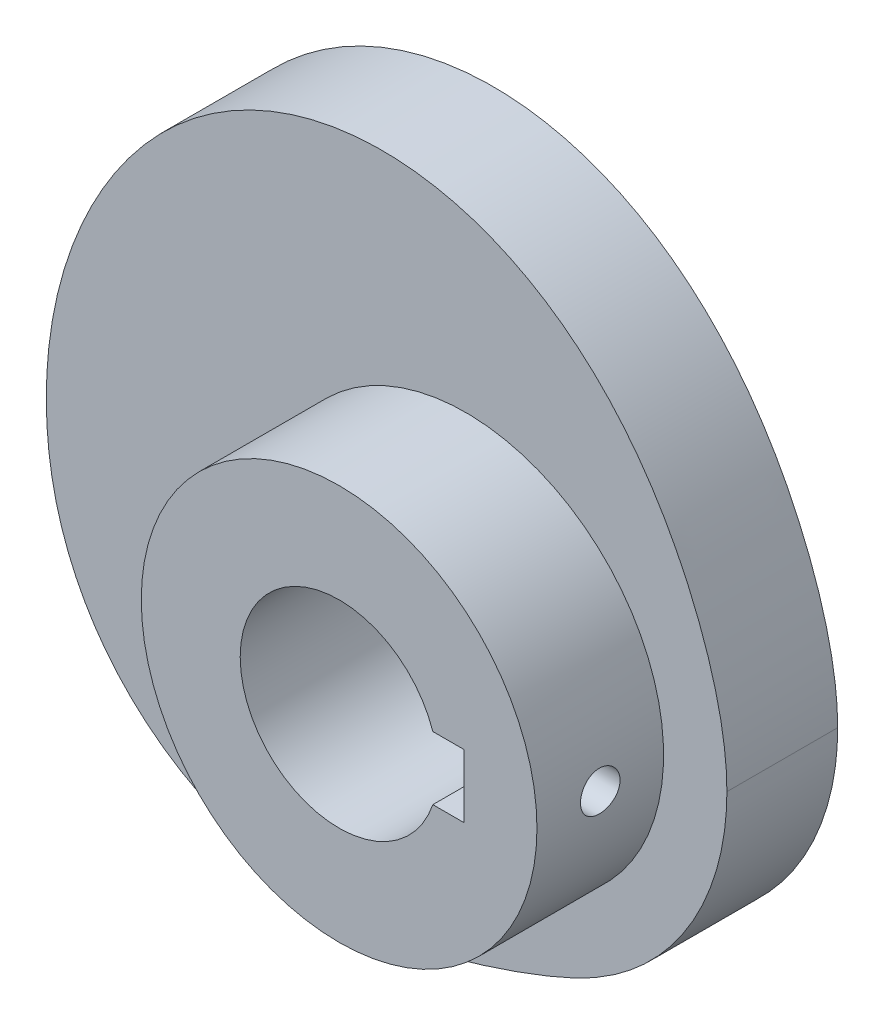
ISO-10303-21;
HEADER;
FILE_DESCRIPTION(('STEP AP214'),'2;1');
FILE_NAME('part.step','',(''),(''),'','','');
FILE_SCHEMA(('AUTOMOTIVE_DESIGN { 1 0 10303 214 1 1 1 1 }'));
ENDSEC;
DATA;
#1=APPLICATION_CONTEXT('core data for automotive mechanical design processes');
#2=APPLICATION_PROTOCOL_DEFINITION('international standard','automotive_design',2000,#1);
#3=PRODUCT_CONTEXT('',#1,'mechanical');
#4=PRODUCT('Part','Part','',(#3));
#5=PRODUCT_RELATED_PRODUCT_CATEGORY('part','',(#4));
#6=PRODUCT_DEFINITION_FORMATION('','',#4);
#7=PRODUCT_DEFINITION_CONTEXT('part definition',#1,'design');
#8=PRODUCT_DEFINITION('design','',#6,#7);
#9=PRODUCT_DEFINITION_SHAPE('','',#8);
#10=(LENGTH_UNIT() NAMED_UNIT(*) SI_UNIT(.MILLI.,.METRE.));
#11=(NAMED_UNIT(*) PLANE_ANGLE_UNIT() SI_UNIT($,.RADIAN.));
#12=(NAMED_UNIT(*) SI_UNIT($,.STERADIAN.) SOLID_ANGLE_UNIT());
#13=UNCERTAINTY_MEASURE_WITH_UNIT(LENGTH_MEASURE(1.E-05),#10,'distance_accuracy_value','');
#14=(GEOMETRIC_REPRESENTATION_CONTEXT(3) GLOBAL_UNCERTAINTY_ASSIGNED_CONTEXT((#13)) GLOBAL_UNIT_ASSIGNED_CONTEXT((#10,
#11,#12)) REPRESENTATION_CONTEXT('',''));
#15=CARTESIAN_POINT('',(0.,0.,0.));
#16=DIRECTION('',(0.,0.,1.));
#17=DIRECTION('',(1.,0.,0.));
#18=AXIS2_PLACEMENT_3D('',#15,#16,#17);
#19=CARTESIAN_POINT('',(28.578838085827,-16.4999998513432,0.));
#20=DIRECTION('',(0.,0.,-1.));
#21=DIRECTION('',(-1.,0.,0.));
#22=AXIS2_PLACEMENT_3D('',#19,#20,#21);
#23=PLANE('',#22);
#24=CARTESIAN_POINT('',(16.5,-28.578838,0.));
#25=CARTESIAN_POINT('',(17.1166899289285,-28.2070796491057,0.));
#26=CARTESIAN_POINT('',(18.350069624829,-27.4635630449492,0.));
#27=CARTESIAN_POINT('',(20.102628450112,-26.1978925112534,0.));
#28=CARTESIAN_POINT('',(21.774178874942,-24.828826667337,0.));
#29=CARTESIAN_POINT('',(23.3511287098356,-23.3510842441702,0.));
#30=CARTESIAN_POINT('',(24.8284502910512,-21.7739803613036,0.));
#31=CARTESIAN_POINT('',(26.1993535504096,-20.1034669701339,0.));
#32=CARTESIAN_POINT('',(27.4580952644465,-18.3469140582888,0.));
#33=CARTESIAN_POINT('',(28.5992480068014,-16.5117838815925,0.));
#34=CARTESIAN_POINT('',(29.6179404348356,-14.6059508778248,0.));
#35=CARTESIAN_POINT('',(30.5097911628376,-12.6375727766297,0.));
#36=CARTESIAN_POINT('',(31.2710442196456,-10.6150777139639,0.));
#37=CARTESIAN_POINT('',(31.898195970656,-8.5471283313419,0.));
#38=CARTESIAN_POINT('',(32.3894834578111,-6.44257855065583,0.));
#39=CARTESIAN_POINT('',(32.7393547723517,-4.31044056203918,0.));
#40=CARTESIAN_POINT('',(32.9591772945797,-2.1598445198068,0.));
#41=CARTESIAN_POINT('',(32.986392431877,-0.719948154730329,0.));
#42=CARTESIAN_POINT('',(33.,0.,0.));
#43=B_SPLINE_CURVE_WITH_KNOTS('',3,(#24,#25,#26,#27,#28,#29,#30,#31,#32,#33,#34,#35,#36,#37,#38,
#39,#40,#41,#42),.UNSPECIFIED.,.F.,.F.,(4,1,1,1,1,1,1,1,1,1,1,1,1,1,1,1,4),(0.,
0.0625000063306743,0.124999996247453,0.187499991860959,0.249999997516402,0.312500003171846,
0.374999998785351,0.43749998870213,0.499999995032804,0.562499987878882,0.625000012061153,
0.687500007795423,0.750000012058307,0.812499988379478,0.87500000855533,0.93750000669172,1.),.UNSPECIFIED.);
#44=CARTESIAN_POINT('',(16.5,-28.578838,0.));
#45=VERTEX_POINT('',#44);
#46=CARTESIAN_POINT('',(33.,0.,0.));
#47=VERTEX_POINT('',#46);
#48=EDGE_CURVE('E179',#45,#47,#43,.T.);
#49=ORIENTED_EDGE('',*,*,#48,.F.);
#50=CARTESIAN_POINT('',(-53.,0.,0.));
#51=CARTESIAN_POINT('',(-52.9945363062946,-0.578068365332441,0.));
#52=CARTESIAN_POINT('',(-52.9836104868245,-1.73403920511571,0.));
#53=CARTESIAN_POINT('',(-52.890921769427,-3.46568765270905,0.));
#54=CARTESIAN_POINT('',(-52.7374598038813,-5.19215391690013,0.));
#55=CARTESIAN_POINT('',(-52.5148302049885,-6.91036840578619,0.));
#56=CARTESIAN_POINT('',(-52.2217501532191,-8.61686948268475,0.));
#57=CARTESIAN_POINT('',(-51.8557563160186,-10.3078824401713,0.));
#58=CARTESIAN_POINT('',(-51.4154312794327,-11.9793866030006,0.));
#59=CARTESIAN_POINT('',(-50.8998144352132,-13.6271855886244,0.));
#60=CARTESIAN_POINT('',(-50.3085555851572,-15.2469726751658,0.));
#61=CARTESIAN_POINT('',(-49.641851524588,-16.8343909244741,0.));
#62=CARTESIAN_POINT('',(-48.9004600902459,-18.3850997510066,0.));
#63=CARTESIAN_POINT('',(-48.085659908377,-19.8948260062158,0.));
#64=CARTESIAN_POINT('',(-47.1992337490278,-21.3594198165388,0.));
#65=CARTESIAN_POINT('',(-46.2434415594617,-22.774906590107,0.));
#66=CARTESIAN_POINT('',(-45.2209799766296,-24.1375264215479,0.));
#67=CARTESIAN_POINT('',(-44.1349548654047,-25.4437814628419,0.));
#68=CARTESIAN_POINT('',(-42.9888397393063,-26.6904701756234,0.));
#69=CARTESIAN_POINT('',(-41.7864313686908,-27.8747177826873,0.));
#70=CARTESIAN_POINT('',(-40.5318120225715,-28.9940039940578,0.));
#71=CARTESIAN_POINT('',(-39.2293027698286,-30.0461878366755,0.));
#72=CARTESIAN_POINT('',(-37.8834208954895,-31.029524246856,0.));
#73=CARTESIAN_POINT('',(-36.4988284078436,-31.9426737601433,0.));
#74=CARTESIAN_POINT('',(-35.0802936700399,-32.784716600772,0.));
#75=CARTESIAN_POINT('',(-33.6326370679417,-33.5551471301013,0.));
#76=CARTESIAN_POINT('',(-32.160696249075,-34.2538859213743,0.));
#77=CARTESIAN_POINT('',(-30.6692720105777,-34.8812587564757,0.));
#78=CARTESIAN_POINT('',(-29.1630928838524,-35.4379982235559,0.));
#79=CARTESIAN_POINT('',(-27.6467700085214,-35.925222877582,0.));
#80=CARTESIAN_POINT('',(-26.1247614728438,-36.344421791911,0.));
#81=CARTESIAN_POINT('',(-24.6013355179007,-36.6974365904857,0.));
#82=CARTESIAN_POINT('',(-23.0805354486785,-36.9864248186663,0.));
#83=CARTESIAN_POINT('',(-21.5661516205252,-37.2138447897136,0.));
#84=CARTESIAN_POINT('',(-20.0616931802454,-37.3824160116332,0.));
#85=CARTESIAN_POINT('',(-18.5703647540076,-37.4950891154986,0.));
#86=CARTESIAN_POINT('',(-17.0950474497053,-37.5550101850944,0.));
#87=CARTESIAN_POINT('',(-15.6382830299636,-37.5654782542873,0.));
#88=CARTESIAN_POINT('',(-14.2022609450344,-37.5299112577126,0.));
#89=CARTESIAN_POINT('',(-12.7888156041856,-37.4518087578511,0.));
#90=CARTESIAN_POINT('',(-11.3994080980389,-37.3346975744079,0.));
#91=CARTESIAN_POINT('',(-9.59492483766799,-37.1328821083215,0.));
#92=CARTESIAN_POINT('',(-7.40354882210842,-36.8025990297333,0.));
#93=CARTESIAN_POINT('',(-4.85765349087417,-36.3014700952593,0.));
#94=CARTESIAN_POINT('',(-2.41369134496373,-35.7228059635646,0.));
#95=CARTESIAN_POINT('',(-0.0645813522270902,-35.0869522056337,0.));
#96=CARTESIAN_POINT('',(2.19985326958517,-34.4095995341932,0.));
#97=CARTESIAN_POINT('',(4.39149988102246,-33.7009626617233,0.));
#98=CARTESIAN_POINT('',(6.52257744357513,-32.9653358383566,0.));
#99=CARTESIAN_POINT('',(8.60383085980721,-32.2004149365869,0.));
#100=CARTESIAN_POINT('',(10.6436475290407,-31.3986738266466,0.));
#101=CARTESIAN_POINT('',(12.6435773429777,-30.5428361558484,0.));
#102=CARTESIAN_POINT('',(14.6069775683268,-29.6247424262529,0.));
#103=CARTESIAN_POINT('',(15.8693730926738,-28.9272625419657,0.));
#104=CARTESIAN_POINT('',(16.5,-28.578838,0.));
#105=B_SPLINE_CURVE_WITH_KNOTS('',3,(#50,#51,#52,#53,#54,#55,#56,#57,#58,#59,#60,#61,#62,#63,
#64,#65,#66,#67,#68,#69,#70,#71,#72,#73,#74,#75,#76,#77,#78,#79,#80,#81,#82,#83,#84,#85,#86,#87,
#88,#89,#90,#91,#92,#93,#94,#95,#96,#97,#98,#99,#100,#101,#102,#103,#104),.UNSPECIFIED.,.F.,.F.,
(4,1,1,1,1,1,1,1,1,1,1,1,1,1,1,1,1,1,1,1,1,1,1,1,1,1,1,1,1,1,1,1,1,1,1,1,1,1,1,1,1,1,1,1,1,1,1,
1,1,1,1,1,4),(0.,0.0186174851039661,0.0372296274644047,0.0558350319619639,0.0744315227383622,
0.0930163921489915,0.11158660401444,0.130138962156089,0.148670156923718,0.167176823955324,
0.185655535136526,0.204102805231572,0.222515020157585,0.240888410738461,0.259219007876638,
0.277502562280803,0.295734480652181,0.313909832696414,0.332023233976416,0.350068877246694,
0.368040428069275,0.3859311356514,0.403733695557261,0.421440372912698,0.439042967704776,
0.456532891569437,0.473901167146655,0.491138558524494,0.508235601392339,0.525182699448169,
0.541970207413214,0.558588572955453,0.5750283936123,0.591280583424684,0.607336484223478,
0.623187988341157,0.638827664878282,0.654248924468525,0.669446162095642,0.684414829865622,
0.699151657566101,0.727921525909658,0.755761390622188,0.782700658967741,0.80879661876053,
0.834133633460633,0.858819493288142,0.882978406103791,0.906741052244658,0.930232420336722,
0.95355950224746,0.976800751501777,1.),.UNSPECIFIED.);
#106=CARTESIAN_POINT('',(-53.,0.,0.));
#107=VERTEX_POINT('',#106);
#108=EDGE_CURVE('E99',#107,#45,#105,.T.);
#109=ORIENTED_EDGE('',*,*,#108,.F.);
#110=CARTESIAN_POINT('',(-45.899346,26.5,0.));
#111=CARTESIAN_POINT('',(-46.1836860137075,25.9965847596235,0.));
#112=CARTESIAN_POINT('',(-46.7523659122866,24.9897545069704,0.));
#113=CARTESIAN_POINT('',(-47.5421516034778,23.4451453502452,0.));
#114=CARTESIAN_POINT('',(-48.2845583567259,21.8774686974248,0.));
#115=CARTESIAN_POINT('',(-48.9743128947939,20.285818041497,0.));
#116=CARTESIAN_POINT('',(-49.6118797343356,18.6725919236129,0.));
#117=CARTESIAN_POINT('',(-50.1962525411938,17.0393312650073,0.));
#118=CARTESIAN_POINT('',(-50.7268922146501,15.3878346859267,0.));
#119=CARTESIAN_POINT('',(-51.203206676827,13.7198577571732,0.));
#120=CARTESIAN_POINT('',(-51.6246945801624,12.0371901358917,0.));
#121=CARTESIAN_POINT('',(-51.9908952368655,10.3416326731438,0.));
#122=CARTESIAN_POINT('',(-52.3014444869964,8.63500111408952,0.));
#123=CARTESIAN_POINT('',(-52.5559088274515,6.91912278801641,0.));
#124=CARTESIAN_POINT('',(-52.7543882237536,5.19583561534353,0.));
#125=CARTESIAN_POINT('',(-52.8952841134237,3.4669843645388,0.));
#126=CARTESIAN_POINT('',(-52.9836134603779,1.73442084773821,0.));
#127=CARTESIAN_POINT('',(-52.9945378210886,0.578140180692734,0.));
#128=CARTESIAN_POINT('',(-53.,0.,0.));
#129=B_SPLINE_CURVE_WITH_KNOTS('',3,(#110,#111,#112,#113,#114,#115,#116,#117,#118,#119,#120,
#121,#122,#123,#124,#125,#126,#127,#128),.UNSPECIFIED.,.F.,.F.,(4,1,1,1,1,1,1,1,1,1,1,1,1,1,1,1,
4),(0.,0.0625000078703979,0.124999987421753,0.187499995710605,0.249999999021572,
0.312499987236457,0.374999993855171,0.437500002039394,0.500000018639912,0.562500001384372,
0.625000005541015,0.687500007451868,0.750000010070087,0.812500018996842,0.874999996047821,
0.937500014545635,1.),.UNSPECIFIED.);
#130=CARTESIAN_POINT('',(-45.899346,26.5,0.));
#131=VERTEX_POINT('',#130);
#132=EDGE_CURVE('E240',#131,#107,#129,.T.);
#133=ORIENTED_EDGE('',*,*,#132,.F.);
#134=CARTESIAN_POINT('',(33.,0.,0.));
#135=CARTESIAN_POINT('',(32.9946845874916,0.450024214519821,0.));
#136=CARTESIAN_POINT('',(32.9840520784817,1.35021521718533,0.));
#137=CARTESIAN_POINT('',(32.9010762576012,2.69865364456309,0.));
#138=CARTESIAN_POINT('',(32.7728602045317,4.04392725143598,0.));
#139=CARTESIAN_POINT('',(32.5973245705466,5.3849748162332,0.));
#140=CARTESIAN_POINT('',(32.3786345464459,6.72119817112379,0.));
#141=CARTESIAN_POINT('',(32.032078752326,8.49828425373111,0.));
#142=CARTESIAN_POINT('',(31.5017033412958,10.7104713359381,0.));
#143=CARTESIAN_POINT('',(30.7266993306015,13.3474272231683,0.));
#144=CARTESIAN_POINT('',(29.8204229849853,15.978337375123,0.));
#145=CARTESIAN_POINT('',(28.7837689397531,18.6116766436554,0.));
#146=CARTESIAN_POINT('',(27.6102738875642,21.2543392791593,0.));
#147=CARTESIAN_POINT('',(26.5151828536235,23.4510328700328,0.));
#148=CARTESIAN_POINT('',(25.5574803004343,25.2113438022052,0.));
#149=CARTESIAN_POINT('',(24.7890166322811,26.5427004497542,0.));
#150=CARTESIAN_POINT('',(23.972675771876,27.8741499307644,0.));
#151=CARTESIAN_POINT('',(23.1054721481577,29.2036713571235,0.));
#152=CARTESIAN_POINT('',(22.1844217817856,30.5286884080539,0.));
#153=CARTESIAN_POINT('',(21.2066029835388,31.8460694318235,0.));
#154=CARTESIAN_POINT('',(20.1692474299252,33.1521370518273,0.));
#155=CARTESIAN_POINT('',(19.0698119848369,34.4426778219421,0.));
#156=CARTESIAN_POINT('',(17.9060623601378,35.7129772324623,0.));
#157=CARTESIAN_POINT('',(16.6761408584454,36.9578521123952,0.));
#158=CARTESIAN_POINT('',(15.3786394503744,38.1717045298225,0.));
#159=CARTESIAN_POINT('',(14.0126573826075,39.3485747589862,0.));
#160=CARTESIAN_POINT('',(12.5778582895929,40.4822122103819,0.));
#161=CARTESIAN_POINT('',(11.0745094204099,41.5661418579364,0.));
#162=CARTESIAN_POINT('',(9.50352423448037,42.5937537412049,0.));
#163=CARTESIAN_POINT('',(7.86647795511403,43.5583750544886,0.));
#164=CARTESIAN_POINT('',(6.16562729642966,44.4533664081926,0.));
#165=CARTESIAN_POINT('',(4.40390858781568,45.2722049343608,0.));
#166=CARTESIAN_POINT('',(2.58492686874716,46.0085710661769,0.));
#167=CARTESIAN_POINT('',(0.712936618187836,46.6564381224942,0.));
#168=CARTESIAN_POINT('',(-1.20719379724785,47.2101508019439,0.));
#169=CARTESIAN_POINT('',(-3.17002194575647,47.664511789956,0.));
#170=CARTESIAN_POINT('',(-5.16959012199404,48.0148348631018,0.));
#171=CARTESIAN_POINT('',(-7.19948182982754,48.2570323616368,0.));
#172=CARTESIAN_POINT('',(-9.25289570505983,48.3876501525639,0.));
#173=CARTESIAN_POINT('',(-11.3227212257513,48.4039215272468,0.));
#174=CARTESIAN_POINT('',(-13.4016199530029,48.3038029160985,0.));
#175=CARTESIAN_POINT('',(-15.4821121569477,48.0859926660634,0.));
#176=CARTESIAN_POINT('',(-17.5566633845015,47.749948390463,0.));
#177=CARTESIAN_POINT('',(-19.6177711066917,47.2958728161982,0.));
#178=CARTESIAN_POINT('',(-21.6580565608833,46.7247269565227,0.));
#179=CARTESIAN_POINT('',(-23.6703421162659,46.0381766881075,0.));
#180=CARTESIAN_POINT('',(-25.6477381016297,45.2385850556535,0.));
#181=CARTESIAN_POINT('',(-27.5837090792366,44.3289449763635,0.));
#182=CARTESIAN_POINT('',(-29.4721493742742,43.3128444190996,0.));
#183=CARTESIAN_POINT('',(-31.3074333737559,42.1943869644305,0.));
#184=CARTESIAN_POINT('',(-33.084472118934,40.9781366815309,0.));
#185=CARTESIAN_POINT('',(-34.7987451821317,39.6690315462074,0.));
#186=CARTESIAN_POINT('',(-36.4463394255874,38.2723143524846,0.));
#187=CARTESIAN_POINT('',(-38.023943914447,36.7934348360469,0.));
#188=CARTESIAN_POINT('',(-39.5289229581215,35.2380092788347,0.));
#189=CARTESIAN_POINT('',(-40.9590788073137,33.6115994032802,0.));
#190=CARTESIAN_POINT('',(-42.313460642713,31.9201141235529,0.));
#191=CARTESIAN_POINT('',(-43.5893115065659,30.167983471433,0.));
#192=CARTESIAN_POINT('',(-44.793272703984,28.3645729647359,0.));
#193=CARTESIAN_POINT('',(-45.5306370579689,27.121554401181,0.));
#194=CARTESIAN_POINT('',(-45.899346,26.5,0.));
#195=B_SPLINE_CURVE_WITH_KNOTS('',3,(#134,#135,#136,#137,#138,#139,#140,#141,#142,#143,#144,
#145,#146,#147,#148,#149,#150,#151,#152,#153,#154,#155,#156,#157,#158,#159,#160,#161,#162,#163,
#164,#165,#166,#167,#168,#169,#170,#171,#172,#173,#174,#175,#176,#177,#178,#179,#180,#181,#182,
#183,#184,#185,#186,#187,#188,#189,#190,#191,#192,#193,#194),.UNSPECIFIED.,.F.,.F.,(4,1,1,1,1,1,
1,1,1,1,1,1,1,1,1,1,1,1,1,1,1,1,1,1,1,1,1,1,1,1,1,1,1,1,1,1,1,1,1,1,1,1,1,1,1,1,1,1,1,1,1,1,1,1,
1,1,1,1,4),(0.,0.0117205282783169,0.0234447697750781,0.0351744705281154,0.046912746341118,
0.0586641719946366,0.0704348494916653,0.0940642765897192,0.117883715435382,0.141995125395694,
0.166516264642816,0.191571890577595,0.217283663266484,0.23042131203172,0.243762401315273,
0.257317187425028,0.271094268568052,0.28510043841581,0.299340704140231,0.313818208961214,
0.328534322198385,0.343488665239924,0.358679258315779,0.37410261894182,0.38975390965422,
0.405627104620671,0.421715167503194,0.438010207940165,0.454503662294259,0.471186473282585,
0.488049228975582,0.505082313708544,0.522276078612953,0.539620899312321,0.557107331053386,
0.574726160616583,0.592468467258825,0.610325686202955,0.628289599830296,0.646352392747892,
0.66450659938883,0.682745118401727,0.701061151668806,0.719448203642738,0.73790004363918,
0.756410636351783,0.774974145462075,0.793584899613972,0.812237382507092,0.830926227101662,
0.849646229501517,0.86839238988363,0.887159976664578,0.905944539718022,0.924742047083589,
0.943548942386566,0.962362268622502,0.981179768127317,1.),.UNSPECIFIED.);
#196=EDGE_CURVE('E232',#47,#131,#195,.T.);
#197=ORIENTED_EDGE('',*,*,#196,.F.);
#198=EDGE_LOOP('',(#49,#109,#133,#197));
#199=FACE_BOUND('',#198,.T.);
#200=CARTESIAN_POINT('',(0.,0.,0.));
#201=DIRECTION('',(0.,0.,1.));
#202=DIRECTION('',(1.,0.,0.));
#203=AXIS2_PLACEMENT_3D('',#200,#201,#202);
#204=CIRCLE('',#203,12.5);
#205=CARTESIAN_POINT('',(11.842719282327,4.,0.));
#206=VERTEX_POINT('',#205);
#207=CARTESIAN_POINT('',(11.842719282327,-4.,0.));
#208=VERTEX_POINT('',#207);
#209=EDGE_CURVE('E148',#206,#208,#204,.T.);
#210=ORIENTED_EDGE('',*,*,#209,.T.);
#211=DIRECTION('',(1.,0.,0.));
#212=VECTOR('',#211,1.);
#213=CARTESIAN_POINT('',(0.,-4.,0.));
#214=LINE('',#213,#212);
#215=CARTESIAN_POINT('',(15.8,-4.,0.));
#216=VERTEX_POINT('',#215);
#217=EDGE_CURVE('E159',#208,#216,#214,.T.);
#218=ORIENTED_EDGE('',*,*,#217,.T.);
#219=DIRECTION('',(0.,1.,0.));
#220=VECTOR('',#219,1.);
#221=CARTESIAN_POINT('',(15.8,-4.,0.));
#222=LINE('',#221,#220);
#223=CARTESIAN_POINT('',(15.8,4.,0.));
#224=VERTEX_POINT('',#223);
#225=EDGE_CURVE('E145',#216,#224,#222,.T.);
#226=ORIENTED_EDGE('',*,*,#225,.T.);
#227=DIRECTION('',(-1.,0.,0.));
#228=VECTOR('',#227,1.);
#229=CARTESIAN_POINT('',(15.8,4.,0.));
#230=LINE('',#229,#228);
#231=EDGE_CURVE('E140',#224,#206,#230,.T.);
#232=ORIENTED_EDGE('',*,*,#231,.T.);
#233=EDGE_LOOP('',(#210,#218,#226,#232));
#234=FACE_BOUND('',#233,.T.);
#235=ADVANCED_FACE('F51',(#199,#234),#23,.T.);
#236=CARTESIAN_POINT('',(0.,0.,30.));
#237=DIRECTION('',(0.,0.,1.));
#238=DIRECTION('',(1.,0.,0.));
#239=AXIS2_PLACEMENT_3D('',#236,#237,#238);
#240=PLANE('',#239);
#241=CARTESIAN_POINT('',(0.,0.,30.));
#242=DIRECTION('',(0.,0.,1.));
#243=DIRECTION('',(1.,0.,0.));
#244=AXIS2_PLACEMENT_3D('',#241,#242,#243);
#245=CIRCLE('',#244,25.);
#246=CARTESIAN_POINT('',(25.,0.,30.));
#247=VERTEX_POINT('',#246);
#248=EDGE_CURVE('E173',#247,#247,#245,.T.);
#249=ORIENTED_EDGE('',*,*,#248,.T.);
#250=EDGE_LOOP('',(#249));
#251=FACE_BOUND('',#250,.T.);
#252=DIRECTION('',(0.,1.,0.));
#253=VECTOR('',#252,1.);
#254=CARTESIAN_POINT('',(15.8,-4.,30.));
#255=LINE('',#254,#253);
#256=CARTESIAN_POINT('',(15.8,-4.,30.));
#257=VERTEX_POINT('',#256);
#258=CARTESIAN_POINT('',(15.8,4.,30.));
#259=VERTEX_POINT('',#258);
#260=EDGE_CURVE('E139',#257,#259,#255,.T.);
#261=ORIENTED_EDGE('',*,*,#260,.F.);
#262=DIRECTION('',(1.,0.,0.));
#263=VECTOR('',#262,1.);
#264=CARTESIAN_POINT('',(0.,-4.,30.));
#265=LINE('',#264,#263);
#266=CARTESIAN_POINT('',(11.842719282327,-4.,30.));
#267=VERTEX_POINT('',#266);
#268=EDGE_CURVE('E129',#267,#257,#265,.T.);
#269=ORIENTED_EDGE('',*,*,#268,.F.);
#270=CARTESIAN_POINT('',(0.,0.,30.));
#271=DIRECTION('',(0.,0.,1.));
#272=DIRECTION('',(1.,0.,0.));
#273=AXIS2_PLACEMENT_3D('',#270,#271,#272);
#274=CIRCLE('',#273,12.5);
#275=CARTESIAN_POINT('',(11.842719282327,4.,30.));
#276=VERTEX_POINT('',#275);
#277=EDGE_CURVE('E170',#276,#267,#274,.T.);
#278=ORIENTED_EDGE('',*,*,#277,.F.);
#279=DIRECTION('',(-1.,0.,0.));
#280=VECTOR('',#279,1.);
#281=CARTESIAN_POINT('',(15.8,4.,30.));
#282=LINE('',#281,#280);
#283=EDGE_CURVE('E69',#259,#276,#282,.T.);
#284=ORIENTED_EDGE('',*,*,#283,.F.);
#285=EDGE_LOOP('',(#261,#269,#278,#284));
#286=FACE_BOUND('',#285,.T.);
#287=ADVANCED_FACE('F151',(#251,#286),#240,.T.);
#288=CARTESIAN_POINT('',(0.,0.,30.));
#289=DIRECTION('',(0.,0.,-1.));
#290=DIRECTION('',(-1.,0.,0.));
#291=AXIS2_PLACEMENT_3D('',#288,#289,#290);
#292=CYLINDRICAL_SURFACE('',#291,12.5);
#293=ORIENTED_EDGE('',*,*,#277,.T.);
#294=DIRECTION('',(0.,0.,-1.));
#295=VECTOR('',#294,1.);
#296=CARTESIAN_POINT('',(11.842719282327,-4.,30.));
#297=LINE('',#296,#295);
#298=EDGE_CURVE('E12',#267,#208,#297,.T.);
#299=ORIENTED_EDGE('',*,*,#298,.T.);
#300=ORIENTED_EDGE('',*,*,#209,.F.);
#301=DIRECTION('',(0.,0.,-1.));
#302=VECTOR('',#301,1.);
#303=CARTESIAN_POINT('',(11.842719282327,4.,30.));
#304=LINE('',#303,#302);
#305=EDGE_CURVE('E62',#206,#276,#304,.F.);
#306=ORIENTED_EDGE('',*,*,#305,.T.);
#307=EDGE_LOOP('',(#293,#299,#300,#306));
#308=FACE_BOUND('',#307,.T.);
#309=ADVANCED_FACE('F272',(#308),#292,.F.);
#310=CARTESIAN_POINT('',(16.5,-28.578838,14.));
#311=CARTESIAN_POINT('',(17.1166899289285,-28.2070796491057,14.));
#312=CARTESIAN_POINT('',(18.350069624829,-27.4635630449492,14.));
#313=CARTESIAN_POINT('',(20.102628450112,-26.1978925112534,14.));
#314=CARTESIAN_POINT('',(21.774178874942,-24.828826667337,14.));
#315=CARTESIAN_POINT('',(23.3511287098356,-23.3510842441702,14.));
#316=CARTESIAN_POINT('',(24.8284502910512,-21.7739803613036,14.));
#317=CARTESIAN_POINT('',(26.1993535504096,-20.1034669701339,14.));
#318=CARTESIAN_POINT('',(27.4580952644465,-18.3469140582888,14.));
#319=CARTESIAN_POINT('',(28.5992480068014,-16.5117838815925,14.));
#320=CARTESIAN_POINT('',(29.6179404348356,-14.6059508778248,14.));
#321=CARTESIAN_POINT('',(30.5097911628376,-12.6375727766297,14.));
#322=CARTESIAN_POINT('',(31.2710442196456,-10.6150777139639,14.));
#323=CARTESIAN_POINT('',(31.898195970656,-8.5471283313419,14.));
#324=CARTESIAN_POINT('',(32.3894834578111,-6.44257855065583,14.));
#325=CARTESIAN_POINT('',(32.7393547723517,-4.31044056203918,14.));
#326=CARTESIAN_POINT('',(32.9591772945797,-2.1598445198068,14.));
#327=CARTESIAN_POINT('',(32.986392431877,-0.719948154730329,14.));
#328=CARTESIAN_POINT('',(33.,0.,14.));
#329=B_SPLINE_CURVE_WITH_KNOTS('',3,(#310,#311,#312,#313,#314,#315,#316,#317,#318,#319,#320,
#321,#322,#323,#324,#325,#326,#327,#328),.UNSPECIFIED.,.F.,.F.,(4,1,1,1,1,1,1,1,1,1,1,1,1,1,1,1,
4),(0.,0.0625000063306743,0.124999996247453,0.187499991860959,0.249999997516402,
0.312500003171846,0.374999998785351,0.43749998870213,0.499999995032804,0.562499987878882,
0.625000012061153,0.687500007795423,0.750000012058307,0.812499988379478,0.87500000855533,
0.93750000669172,1.),.UNSPECIFIED.);
#330=DIRECTION('',(0.,0.,-1.));
#331=VECTOR('',#330,1.);
#332=SURFACE_OF_LINEAR_EXTRUSION('',#329,#331);
#333=ORIENTED_EDGE('',*,*,#48,.T.);
#334=DIRECTION('',(0.,0.,-1.));
#335=VECTOR('',#334,1.);
#336=CARTESIAN_POINT('',(33.,0.,14.));
#337=LINE('',#336,#335);
#338=CARTESIAN_POINT('',(33.,0.,14.));
#339=VERTEX_POINT('',#338);
#340=EDGE_CURVE('E183',#339,#47,#337,.T.);
#341=ORIENTED_EDGE('',*,*,#340,.F.);
#342=CARTESIAN_POINT('',(16.5,-28.578838,14.));
#343=VERTEX_POINT('',#342);
#344=EDGE_CURVE('E184',#343,#339,#329,.T.);
#345=ORIENTED_EDGE('',*,*,#344,.F.);
#346=DIRECTION('',(0.,0.,-1.));
#347=VECTOR('',#346,1.);
#348=CARTESIAN_POINT('',(16.5,-28.578838,14.));
#349=LINE('',#348,#347);
#350=EDGE_CURVE('E223',#343,#45,#349,.T.);
#351=ORIENTED_EDGE('',*,*,#350,.T.);
#352=EDGE_LOOP('',(#333,#341,#345,#351));
#353=FACE_BOUND('',#352,.T.);
#354=ADVANCED_FACE('F53',(#353),#332,.F.);
#355=CARTESIAN_POINT('',(33.,0.,14.));
#356=CARTESIAN_POINT('',(32.9946845874916,0.450024214519821,14.));
#357=CARTESIAN_POINT('',(32.9840520784817,1.35021521718533,14.));
#358=CARTESIAN_POINT('',(32.9010762576012,2.69865364456309,14.));
#359=CARTESIAN_POINT('',(32.7728602045317,4.04392725143598,14.));
#360=CARTESIAN_POINT('',(32.5973245705466,5.3849748162332,14.));
#361=CARTESIAN_POINT('',(32.3786345464459,6.72119817112379,14.));
#362=CARTESIAN_POINT('',(32.032078752326,8.49828425373111,14.));
#363=CARTESIAN_POINT('',(31.5017033412958,10.7104713359381,14.));
#364=CARTESIAN_POINT('',(30.7266993306015,13.3474272231683,14.));
#365=CARTESIAN_POINT('',(29.8204229849853,15.978337375123,14.));
#366=CARTESIAN_POINT('',(28.7837689397531,18.6116766436554,14.));
#367=CARTESIAN_POINT('',(27.6102738875642,21.2543392791593,14.));
#368=CARTESIAN_POINT('',(26.5151828536235,23.4510328700328,14.));
#369=CARTESIAN_POINT('',(25.5574803004343,25.2113438022052,14.));
#370=CARTESIAN_POINT('',(24.7890166322811,26.5427004497542,14.));
#371=CARTESIAN_POINT('',(23.972675771876,27.8741499307644,14.));
#372=CARTESIAN_POINT('',(23.1054721481577,29.2036713571235,14.));
#373=CARTESIAN_POINT('',(22.1844217817856,30.5286884080539,14.));
#374=CARTESIAN_POINT('',(21.2066029835388,31.8460694318235,14.));
#375=CARTESIAN_POINT('',(20.1692474299252,33.1521370518273,14.));
#376=CARTESIAN_POINT('',(19.0698119848369,34.4426778219421,14.));
#377=CARTESIAN_POINT('',(17.9060623601378,35.7129772324623,14.));
#378=CARTESIAN_POINT('',(16.6761408584454,36.9578521123952,14.));
#379=CARTESIAN_POINT('',(15.3786394503744,38.1717045298225,14.));
#380=CARTESIAN_POINT('',(14.0126573826075,39.3485747589862,14.));
#381=CARTESIAN_POINT('',(12.5778582895929,40.4822122103819,14.));
#382=CARTESIAN_POINT('',(11.0745094204099,41.5661418579364,14.));
#383=CARTESIAN_POINT('',(9.50352423448037,42.5937537412049,14.));
#384=CARTESIAN_POINT('',(7.86647795511403,43.5583750544886,14.));
#385=CARTESIAN_POINT('',(6.16562729642966,44.4533664081926,14.));
#386=CARTESIAN_POINT('',(4.40390858781568,45.2722049343608,14.));
#387=CARTESIAN_POINT('',(2.58492686874716,46.0085710661769,14.));
#388=CARTESIAN_POINT('',(0.712936618187836,46.6564381224942,14.));
#389=CARTESIAN_POINT('',(-1.20719379724785,47.2101508019439,14.));
#390=CARTESIAN_POINT('',(-3.17002194575647,47.664511789956,14.));
#391=CARTESIAN_POINT('',(-5.16959012199404,48.0148348631018,14.));
#392=CARTESIAN_POINT('',(-7.19948182982754,48.2570323616368,14.));
#393=CARTESIAN_POINT('',(-9.25289570505983,48.3876501525639,14.));
#394=CARTESIAN_POINT('',(-11.3227212257513,48.4039215272468,14.));
#395=CARTESIAN_POINT('',(-13.4016199530029,48.3038029160985,14.));
#396=CARTESIAN_POINT('',(-15.4821121569477,48.0859926660634,14.));
#397=CARTESIAN_POINT('',(-17.5566633845015,47.749948390463,14.));
#398=CARTESIAN_POINT('',(-19.6177711066917,47.2958728161982,14.));
#399=CARTESIAN_POINT('',(-21.6580565608833,46.7247269565227,14.));
#400=CARTESIAN_POINT('',(-23.6703421162659,46.0381766881075,14.));
#401=CARTESIAN_POINT('',(-25.6477381016297,45.2385850556535,14.));
#402=CARTESIAN_POINT('',(-27.5837090792366,44.3289449763635,14.));
#403=CARTESIAN_POINT('',(-29.4721493742742,43.3128444190996,14.));
#404=CARTESIAN_POINT('',(-31.3074333737559,42.1943869644305,14.));
#405=CARTESIAN_POINT('',(-33.084472118934,40.9781366815309,14.));
#406=CARTESIAN_POINT('',(-34.7987451821317,39.6690315462074,14.));
#407=CARTESIAN_POINT('',(-36.4463394255874,38.2723143524846,14.));
#408=CARTESIAN_POINT('',(-38.023943914447,36.7934348360469,14.));
#409=CARTESIAN_POINT('',(-39.5289229581215,35.2380092788347,14.));
#410=CARTESIAN_POINT('',(-40.9590788073137,33.6115994032802,14.));
#411=CARTESIAN_POINT('',(-42.313460642713,31.9201141235529,14.));
#412=CARTESIAN_POINT('',(-43.5893115065659,30.167983471433,14.));
#413=CARTESIAN_POINT('',(-44.793272703984,28.3645729647359,14.));
#414=CARTESIAN_POINT('',(-45.5306370579689,27.121554401181,14.));
#415=CARTESIAN_POINT('',(-45.899346,26.5,14.));
#416=B_SPLINE_CURVE_WITH_KNOTS('',3,(#355,#356,#357,#358,#359,#360,#361,#362,#363,#364,#365,
#366,#367,#368,#369,#370,#371,#372,#373,#374,#375,#376,#377,#378,#379,#380,#381,#382,#383,#384,
#385,#386,#387,#388,#389,#390,#391,#392,#393,#394,#395,#396,#397,#398,#399,#400,#401,#402,#403,
#404,#405,#406,#407,#408,#409,#410,#411,#412,#413,#414,#415),.UNSPECIFIED.,.F.,.F.,(4,1,1,1,1,1,
1,1,1,1,1,1,1,1,1,1,1,1,1,1,1,1,1,1,1,1,1,1,1,1,1,1,1,1,1,1,1,1,1,1,1,1,1,1,1,1,1,1,1,1,1,1,1,1,
1,1,1,1,4),(0.,0.0117205282783169,0.0234447697750781,0.0351744705281154,0.046912746341118,
0.0586641719946366,0.0704348494916653,0.0940642765897192,0.117883715435382,0.141995125395694,
0.166516264642816,0.191571890577595,0.217283663266484,0.23042131203172,0.243762401315273,
0.257317187425028,0.271094268568052,0.28510043841581,0.299340704140231,0.313818208961214,
0.328534322198385,0.343488665239924,0.358679258315779,0.37410261894182,0.38975390965422,
0.405627104620671,0.421715167503194,0.438010207940165,0.454503662294259,0.471186473282585,
0.488049228975582,0.505082313708544,0.522276078612953,0.539620899312321,0.557107331053386,
0.574726160616583,0.592468467258825,0.610325686202955,0.628289599830296,0.646352392747892,
0.66450659938883,0.682745118401727,0.701061151668806,0.719448203642738,0.73790004363918,
0.756410636351783,0.774974145462075,0.793584899613972,0.812237382507092,0.830926227101662,
0.849646229501517,0.86839238988363,0.887159976664578,0.905944539718022,0.924742047083589,
0.943548942386566,0.962362268622502,0.981179768127317,1.),.UNSPECIFIED.);
#417=DIRECTION('',(0.,0.,-1.));
#418=VECTOR('',#417,1.);
#419=SURFACE_OF_LINEAR_EXTRUSION('',#416,#418);
#420=ORIENTED_EDGE('',*,*,#196,.T.);
#421=DIRECTION('',(0.,0.,-1.));
#422=VECTOR('',#421,1.);
#423=CARTESIAN_POINT('',(-45.899346,26.5,14.));
#424=LINE('',#423,#422);
#425=CARTESIAN_POINT('',(-45.899346,26.5,14.));
#426=VERTEX_POINT('',#425);
#427=EDGE_CURVE('E263',#426,#131,#424,.T.);
#428=ORIENTED_EDGE('',*,*,#427,.F.);
#429=EDGE_CURVE('E107',#339,#426,#416,.T.);
#430=ORIENTED_EDGE('',*,*,#429,.F.);
#431=ORIENTED_EDGE('',*,*,#340,.T.);
#432=EDGE_LOOP('',(#420,#428,#430,#431));
#433=FACE_BOUND('',#432,.T.);
#434=ADVANCED_FACE('F206',(#433),#419,.F.);
#435=CARTESIAN_POINT('',(-45.899346,26.5,14.));
#436=CARTESIAN_POINT('',(-46.1836860137075,25.9965847596235,14.));
#437=CARTESIAN_POINT('',(-46.7523659122866,24.9897545069704,14.));
#438=CARTESIAN_POINT('',(-47.5421516034778,23.4451453502452,14.));
#439=CARTESIAN_POINT('',(-48.2845583567259,21.8774686974248,14.));
#440=CARTESIAN_POINT('',(-48.9743128947939,20.285818041497,14.));
#441=CARTESIAN_POINT('',(-49.6118797343356,18.6725919236129,14.));
#442=CARTESIAN_POINT('',(-50.1962525411938,17.0393312650073,14.));
#443=CARTESIAN_POINT('',(-50.7268922146501,15.3878346859267,14.));
#444=CARTESIAN_POINT('',(-51.203206676827,13.7198577571732,14.));
#445=CARTESIAN_POINT('',(-51.6246945801624,12.0371901358917,14.));
#446=CARTESIAN_POINT('',(-51.9908952368655,10.3416326731438,14.));
#447=CARTESIAN_POINT('',(-52.3014444869964,8.63500111408952,14.));
#448=CARTESIAN_POINT('',(-52.5559088274515,6.91912278801641,14.));
#449=CARTESIAN_POINT('',(-52.7543882237536,5.19583561534353,14.));
#450=CARTESIAN_POINT('',(-52.8952841134237,3.4669843645388,14.));
#451=CARTESIAN_POINT('',(-52.9836134603779,1.73442084773821,14.));
#452=CARTESIAN_POINT('',(-52.9945378210886,0.578140180692734,14.));
#453=CARTESIAN_POINT('',(-53.,0.,14.));
#454=B_SPLINE_CURVE_WITH_KNOTS('',3,(#435,#436,#437,#438,#439,#440,#441,#442,#443,#444,#445,
#446,#447,#448,#449,#450,#451,#452,#453),.UNSPECIFIED.,.F.,.F.,(4,1,1,1,1,1,1,1,1,1,1,1,1,1,1,1,
4),(0.,0.0625000078703979,0.124999987421753,0.187499995710605,0.249999999021572,
0.312499987236457,0.374999993855171,0.437500002039394,0.500000018639912,0.562500001384372,
0.625000005541015,0.687500007451868,0.750000010070087,0.812500018996842,0.874999996047821,
0.937500014545635,1.),.UNSPECIFIED.);
#455=DIRECTION('',(0.,0.,-1.));
#456=VECTOR('',#455,1.);
#457=SURFACE_OF_LINEAR_EXTRUSION('',#454,#456);
#458=ORIENTED_EDGE('',*,*,#132,.T.);
#459=DIRECTION('',(0.,0.,-1.));
#460=VECTOR('',#459,1.);
#461=CARTESIAN_POINT('',(-53.,0.,14.));
#462=LINE('',#461,#460);
#463=CARTESIAN_POINT('',(-53.,0.,14.));
#464=VERTEX_POINT('',#463);
#465=EDGE_CURVE('E260',#464,#107,#462,.T.);
#466=ORIENTED_EDGE('',*,*,#465,.F.);
#467=EDGE_CURVE('E198',#426,#464,#454,.T.);
#468=ORIENTED_EDGE('',*,*,#467,.F.);
#469=ORIENTED_EDGE('',*,*,#427,.T.);
#470=EDGE_LOOP('',(#458,#466,#468,#469));
#471=FACE_BOUND('',#470,.T.);
#472=ADVANCED_FACE('F209',(#471),#457,.F.);
#473=CARTESIAN_POINT('',(-53.,0.,14.));
#474=CARTESIAN_POINT('',(-52.9945363062946,-0.578068365332441,14.));
#475=CARTESIAN_POINT('',(-52.9836104868245,-1.73403920511571,14.));
#476=CARTESIAN_POINT('',(-52.890921769427,-3.46568765270905,14.));
#477=CARTESIAN_POINT('',(-52.7374598038813,-5.19215391690013,14.));
#478=CARTESIAN_POINT('',(-52.5148302049885,-6.91036840578619,14.));
#479=CARTESIAN_POINT('',(-52.2217501532191,-8.61686948268475,14.));
#480=CARTESIAN_POINT('',(-51.8557563160186,-10.3078824401713,14.));
#481=CARTESIAN_POINT('',(-51.4154312794327,-11.9793866030006,14.));
#482=CARTESIAN_POINT('',(-50.8998144352132,-13.6271855886244,14.));
#483=CARTESIAN_POINT('',(-50.3085555851572,-15.2469726751658,14.));
#484=CARTESIAN_POINT('',(-49.641851524588,-16.8343909244741,14.));
#485=CARTESIAN_POINT('',(-48.9004600902459,-18.3850997510066,14.));
#486=CARTESIAN_POINT('',(-48.085659908377,-19.8948260062158,14.));
#487=CARTESIAN_POINT('',(-47.1992337490278,-21.3594198165388,14.));
#488=CARTESIAN_POINT('',(-46.2434415594617,-22.774906590107,14.));
#489=CARTESIAN_POINT('',(-45.2209799766296,-24.1375264215479,14.));
#490=CARTESIAN_POINT('',(-44.1349548654047,-25.4437814628419,14.));
#491=CARTESIAN_POINT('',(-42.9888397393063,-26.6904701756234,14.));
#492=CARTESIAN_POINT('',(-41.7864313686908,-27.8747177826873,14.));
#493=CARTESIAN_POINT('',(-40.5318120225715,-28.9940039940578,14.));
#494=CARTESIAN_POINT('',(-39.2293027698286,-30.0461878366755,14.));
#495=CARTESIAN_POINT('',(-37.8834208954895,-31.029524246856,14.));
#496=CARTESIAN_POINT('',(-36.4988284078436,-31.9426737601433,14.));
#497=CARTESIAN_POINT('',(-35.0802936700399,-32.784716600772,14.));
#498=CARTESIAN_POINT('',(-33.6326370679417,-33.5551471301013,14.));
#499=CARTESIAN_POINT('',(-32.160696249075,-34.2538859213743,14.));
#500=CARTESIAN_POINT('',(-30.6692720105777,-34.8812587564757,14.));
#501=CARTESIAN_POINT('',(-29.1630928838524,-35.4379982235559,14.));
#502=CARTESIAN_POINT('',(-27.6467700085214,-35.925222877582,14.));
#503=CARTESIAN_POINT('',(-26.1247614728438,-36.344421791911,14.));
#504=CARTESIAN_POINT('',(-24.6013355179007,-36.6974365904857,14.));
#505=CARTESIAN_POINT('',(-23.0805354486785,-36.9864248186663,14.));
#506=CARTESIAN_POINT('',(-21.5661516205252,-37.2138447897136,14.));
#507=CARTESIAN_POINT('',(-20.0616931802454,-37.3824160116332,14.));
#508=CARTESIAN_POINT('',(-18.5703647540076,-37.4950891154986,14.));
#509=CARTESIAN_POINT('',(-17.0950474497053,-37.5550101850944,14.));
#510=CARTESIAN_POINT('',(-15.6382830299636,-37.5654782542873,14.));
#511=CARTESIAN_POINT('',(-14.2022609450344,-37.5299112577126,14.));
#512=CARTESIAN_POINT('',(-12.7888156041856,-37.4518087578511,14.));
#513=CARTESIAN_POINT('',(-11.3994080980389,-37.3346975744079,14.));
#514=CARTESIAN_POINT('',(-9.59492483766799,-37.1328821083215,14.));
#515=CARTESIAN_POINT('',(-7.40354882210842,-36.8025990297333,14.));
#516=CARTESIAN_POINT('',(-4.85765349087417,-36.3014700952593,14.));
#517=CARTESIAN_POINT('',(-2.41369134496373,-35.7228059635646,14.));
#518=CARTESIAN_POINT('',(-0.0645813522270902,-35.0869522056337,14.));
#519=CARTESIAN_POINT('',(2.19985326958517,-34.4095995341932,14.));
#520=CARTESIAN_POINT('',(4.39149988102246,-33.7009626617233,14.));
#521=CARTESIAN_POINT('',(6.52257744357513,-32.9653358383566,14.));
#522=CARTESIAN_POINT('',(8.60383085980721,-32.2004149365869,14.));
#523=CARTESIAN_POINT('',(10.6436475290407,-31.3986738266466,14.));
#524=CARTESIAN_POINT('',(12.6435773429777,-30.5428361558484,14.));
#525=CARTESIAN_POINT('',(14.6069775683268,-29.6247424262529,14.));
#526=CARTESIAN_POINT('',(15.8693730926738,-28.9272625419657,14.));
#527=CARTESIAN_POINT('',(16.5,-28.578838,14.));
#528=B_SPLINE_CURVE_WITH_KNOTS('',3,(#473,#474,#475,#476,#477,#478,#479,#480,#481,#482,#483,
#484,#485,#486,#487,#488,#489,#490,#491,#492,#493,#494,#495,#496,#497,#498,#499,#500,#501,#502,
#503,#504,#505,#506,#507,#508,#509,#510,#511,#512,#513,#514,#515,#516,#517,#518,#519,#520,#521,
#522,#523,#524,#525,#526,#527),.UNSPECIFIED.,.F.,.F.,(4,1,1,1,1,1,1,1,1,1,1,1,1,1,1,1,1,1,1,1,1,
1,1,1,1,1,1,1,1,1,1,1,1,1,1,1,1,1,1,1,1,1,1,1,1,1,1,1,1,1,1,1,4),(0.,0.0186174851039661,
0.0372296274644047,0.0558350319619639,0.0744315227383622,0.0930163921489915,0.11158660401444,
0.130138962156089,0.148670156923718,0.167176823955324,0.185655535136526,0.204102805231572,
0.222515020157585,0.240888410738461,0.259219007876638,0.277502562280803,0.295734480652181,
0.313909832696414,0.332023233976416,0.350068877246694,0.368040428069275,0.3859311356514,
0.403733695557261,0.421440372912698,0.439042967704776,0.456532891569437,0.473901167146655,
0.491138558524494,0.508235601392339,0.525182699448169,0.541970207413214,0.558588572955453,
0.5750283936123,0.591280583424684,0.607336484223478,0.623187988341157,0.638827664878282,
0.654248924468525,0.669446162095642,0.684414829865622,0.699151657566101,0.727921525909658,
0.755761390622188,0.782700658967741,0.80879661876053,0.834133633460633,0.858819493288142,
0.882978406103791,0.906741052244658,0.930232420336722,0.95355950224746,0.976800751501777,1.),.UNSPECIFIED.);
#529=DIRECTION('',(0.,0.,-1.));
#530=VECTOR('',#529,1.);
#531=SURFACE_OF_LINEAR_EXTRUSION('',#528,#530);
#532=ORIENTED_EDGE('',*,*,#108,.T.);
#533=ORIENTED_EDGE('',*,*,#350,.F.);
#534=EDGE_CURVE('E78',#464,#343,#528,.T.);
#535=ORIENTED_EDGE('',*,*,#534,.F.);
#536=ORIENTED_EDGE('',*,*,#465,.T.);
#537=EDGE_LOOP('',(#532,#533,#535,#536));
#538=FACE_BOUND('',#537,.T.);
#539=ADVANCED_FACE('F212',(#538),#531,.F.);
#540=CARTESIAN_POINT('',(28.578838085827,-16.4999998513432,14.));
#541=DIRECTION('',(0.,0.,-1.));
#542=DIRECTION('',(-1.,0.,0.));
#543=AXIS2_PLACEMENT_3D('',#540,#541,#542);
#544=PLANE('',#543);
#545=CARTESIAN_POINT('',(0.,0.,14.));
#546=DIRECTION('',(0.,0.,-1.));
#547=DIRECTION('',(-1.,0.,0.));
#548=AXIS2_PLACEMENT_3D('',#545,#546,#547);
#549=CIRCLE('',#548,25.);
#550=CARTESIAN_POINT('',(-25.,0.,14.));
#551=VERTEX_POINT('',#550);
#552=EDGE_CURVE('E180',#551,#551,#549,.F.);
#553=ORIENTED_EDGE('',*,*,#552,.F.);
#554=EDGE_LOOP('',(#553));
#555=FACE_BOUND('',#554,.T.);
#556=ORIENTED_EDGE('',*,*,#344,.T.);
#557=ORIENTED_EDGE('',*,*,#429,.T.);
#558=ORIENTED_EDGE('',*,*,#467,.T.);
#559=ORIENTED_EDGE('',*,*,#534,.T.);
#560=EDGE_LOOP('',(#556,#557,#558,#559));
#561=FACE_BOUND('',#560,.T.);
#562=ADVANCED_FACE('F216',(#555,#561),#544,.F.);
#563=CARTESIAN_POINT('',(0.,0.,30.));
#564=DIRECTION('',(0.,0.,-1.));
#565=DIRECTION('',(-1.,0.,0.));
#566=AXIS2_PLACEMENT_3D('',#563,#564,#565);
#567=CYLINDRICAL_SURFACE('',#566,25.);
#568=CARTESIAN_POINT('',(25.,0.,19.5));
#569=CARTESIAN_POINT('',(24.9999983880192,-0.140050884478893,19.5000060647509));
#570=CARTESIAN_POINT('',(24.9988106399051,-0.280194362919433,19.5118081722411));
#571=CARTESIAN_POINT('',(24.9941866898684,-0.556595996242092,19.5587109257261));
#572=CARTESIAN_POINT('',(24.9907480108506,-0.69284969792207,19.5938372400615));
#573=CARTESIAN_POINT('',(24.9820103640768,-0.957429188633535,19.6863556014946));
#574=CARTESIAN_POINT('',(24.9767125200177,-1.08575971153727,19.7437342012962));
#575=CARTESIAN_POINT('',(24.9648489348577,-1.33094040240101,19.8791022698291));
#576=CARTESIAN_POINT('',(24.9582834459533,-1.44779284694769,19.9570876400003));
#577=CARTESIAN_POINT('',(24.9445936085331,-1.6671488766852,20.1317567441557));
#578=CARTESIAN_POINT('',(24.9374675393466,-1.76960536208723,20.2284994985051));
#579=CARTESIAN_POINT('',(24.9234739226566,-1.95685630357746,20.4378113356576));
#580=CARTESIAN_POINT('',(24.9166063871229,-2.04164994270663,20.550381150106));
#581=CARTESIAN_POINT('',(24.9038897888196,-2.19133492610904,20.7884463292091));
#582=CARTESIAN_POINT('',(24.8980429177726,-2.2561836636372,20.9139686102371));
#583=CARTESIAN_POINT('',(24.8880509386631,-2.3638659618569,21.1741889647625));
#584=CARTESIAN_POINT('',(24.8839057885556,-2.40670006647823,21.3088868114599));
#585=CARTESIAN_POINT('',(24.8778021018244,-2.46899760400473,21.583154502165));
#586=CARTESIAN_POINT('',(24.8758362599524,-2.48853913250949,21.7227064421305));
#587=CARTESIAN_POINT('',(24.8742910765131,-2.5039382128384,22.0031221584895));
#588=CARTESIAN_POINT('',(24.8747116722186,-2.499796387177,22.1439859003052));
#589=CARTESIAN_POINT('',(24.8778851724734,-2.46801070063169,22.4224882742333));
#590=CARTESIAN_POINT('',(24.8806296147663,-2.44045211031138,22.5601367483217));
#591=CARTESIAN_POINT('',(24.8881283571855,-2.36274786037646,22.8288449080027));
#592=CARTESIAN_POINT('',(24.8928826844623,-2.31260189563936,22.9599045045626));
#593=CARTESIAN_POINT('',(24.9038752363018,-2.19105223470377,23.2119839682472));
#594=CARTESIAN_POINT('',(24.9101160977039,-2.11961070679994,23.3329854737233));
#595=CARTESIAN_POINT('',(24.923376293322,-1.95752506838306,23.5613130372797));
#596=CARTESIAN_POINT('',(24.9303956503196,-1.86688039584126,23.6686386949544));
#597=CARTESIAN_POINT('',(24.9444596328247,-1.66848528103017,23.8670634849726));
#598=CARTESIAN_POINT('',(24.9515042333249,-1.56066119712841,23.958089004702));
#599=CARTESIAN_POINT('',(24.964795726963,-1.33122370434278,24.120759082276));
#600=CARTESIAN_POINT('',(24.9710426192064,-1.209610279999,24.1924036183912));
#601=CARTESIAN_POINT('',(24.9820368916774,-0.95599526423091,24.3142750507756));
#602=CARTESIAN_POINT('',(24.9867840103692,-0.823991865974757,24.3644982120452));
#603=CARTESIAN_POINT('',(24.9942411860352,-0.55336804332483,24.4420472917794));
#604=CARTESIAN_POINT('',(24.9969513039266,-0.4147478169415,24.4693738949766));
#605=CARTESIAN_POINT('',(25.0000212917078,-0.135462747729758,24.5002607693369));
#606=CARTESIAN_POINT('',(25.0003912066934,0.00519075526373076,24.5039226206312));
#607=CARTESIAN_POINT('',(24.9987660439199,0.28510948328925,24.4876428423781));
#608=CARTESIAN_POINT('',(24.9967709981117,0.424374727051175,24.4677015317118));
#609=CARTESIAN_POINT('',(24.9906465384799,0.697270517086685,24.4048657614461));
#610=CARTESIAN_POINT('',(24.986521547951,0.830912122430045,24.362018863805));
#611=CARTESIAN_POINT('',(24.9765999715152,1.08911080345945,24.2546370649068));
#612=CARTESIAN_POINT('',(24.9708033481313,1.21366767539279,24.1901016774015));
#613=CARTESIAN_POINT('',(24.9581618832606,1.45062045043035,24.0409229033402));
#614=CARTESIAN_POINT('',(24.951313590086,1.56297414937229,23.9562127776855));
#615=CARTESIAN_POINT('',(24.937348321738,1.77190405827969,23.7691848306477));
#616=CARTESIAN_POINT('',(24.9302313398243,1.86847987212294,23.6668665673242));
#617=CARTESIAN_POINT('',(24.9165006035189,2.04346527471786,23.4470835633525));
#618=CARTESIAN_POINT('',(24.9098887534744,2.12180819669886,23.3295656086434));
#619=CARTESIAN_POINT('',(24.8979458115222,2.25764564685957,23.0829815996333));
#620=CARTESIAN_POINT('',(24.8926147021009,2.3151404601347,22.953915703279));
#621=CARTESIAN_POINT('',(24.8838486908512,2.40753802171119,22.6881281513355));
#622=CARTESIAN_POINT('',(24.8804104612447,2.44248043702965,22.5514203997722));
#623=CARTESIAN_POINT('',(24.8758091320719,2.48891001782365,22.2740420050981));
#624=CARTESIAN_POINT('',(24.8746459672546,2.50039785599879,22.1333714757608));
#625=CARTESIAN_POINT('',(24.8747278276891,2.49958284617814,21.8527232791082));
#626=CARTESIAN_POINT('',(24.8759622521752,2.48738472398278,21.712745292793));
#627=CARTESIAN_POINT('',(24.8806775972387,2.43976363240913,21.4368377070793));
#628=CARTESIAN_POINT('',(24.884158520343,2.4043406369054,21.300908112235));
#629=CARTESIAN_POINT('',(24.8929717065797,2.31130421574375,21.0369566273804));
#630=CARTESIAN_POINT('',(24.898303713509,2.25369386085229,20.9089336459257));
#631=CARTESIAN_POINT('',(24.910218795984,2.11792888727761,20.6643577708224));
#632=CARTESIAN_POINT('',(24.9168018645238,2.03977438363853,20.5478048129484));
#633=CARTESIAN_POINT('',(24.9305121802424,1.86474639071333,20.3289408138202));
#634=CARTESIAN_POINT('',(24.9376416181688,1.76779487222567,20.2266923090823));
#635=CARTESIAN_POINT('',(24.9516213682196,1.55807924806278,20.0398694182509));
#636=CARTESIAN_POINT('',(24.9584716130744,1.44531136027064,19.9552992716071));
#637=CARTESIAN_POINT('',(24.971139051729,1.20685358540322,19.8060663653634));
#638=CARTESIAN_POINT('',(24.9769536006703,1.08113187336691,19.741454272637));
#639=CARTESIAN_POINT('',(24.9868657312474,0.820645697751375,19.6343439429403));
#640=CARTESIAN_POINT('',(24.9909652477413,0.685891624564022,19.5918207726161));
#641=CARTESIAN_POINT('',(24.9959553443433,0.45864565351426,19.540698457288));
#642=CARTESIAN_POINT('',(24.9974650172958,0.367606382111272,19.5254573892516));
#643=CARTESIAN_POINT('',(24.9994878737697,0.184391452043282,19.5051061848456));
#644=CARTESIAN_POINT('',(25.0000010614006,0.0922157980663946,19.4999960066953));
#645=CARTESIAN_POINT('',(25.,0.,19.5));
#646=B_SPLINE_CURVE_WITH_KNOTS('',3,(#568,#569,#570,#571,#572,#573,#574,#575,#576,#577,#578,
#579,#580,#581,#582,#583,#584,#585,#586,#587,#588,#589,#590,#591,#592,#593,#594,#595,#596,#597,
#598,#599,#600,#601,#602,#603,#604,#605,#606,#607,#608,#609,#610,#611,#612,#613,#614,#615,#616,
#617,#618,#619,#620,#621,#622,#623,#624,#625,#626,#627,#628,#629,#630,#631,#632,#633,#634,#635,
#636,#637,#638,#639,#640,#641,#642,#643,#644,#645),.UNSPECIFIED.,.T.,.F.,(4,2,2,2,2,2,2,2,2,2,2,
2,2,2,2,2,2,2,2,2,2,2,2,2,2,2,2,2,2,2,2,2,2,2,2,2,2,2,4),(0.,0.419815915671184,
0.840094607088716,1.2601197143305,1.68006134395695,2.10134642155736,2.52265098051764,
2.94484938680555,3.3670373610626,3.78780580112991,4.20856318139441,4.62779493602776,
5.04703235404084,5.46701903432237,5.88701800827813,6.30886835490516,6.73071917449429,
7.15264351733953,7.57455524188598,7.99465471519394,8.41474851297858,8.83397338235761,
9.25320765123667,9.67384851871745,10.0944999452557,10.5166660902149,10.9388264618843,
11.3602422648251,11.7816459809896,12.2011907323489,12.620735955651,13.04022313407,
13.459707963474,13.8809729356913,14.3023388159239,14.724765775656,15.1467148698824,
15.4231416808087,15.6995673517257),.UNSPECIFIED.);
#647=CARTESIAN_POINT('',(25.,0.,19.5));
#648=VERTEX_POINT('',#647);
#649=EDGE_CURVE('E162',#648,#648,#646,.T.);
#650=ORIENTED_EDGE('',*,*,#649,.T.);
#651=EDGE_LOOP('',(#650));
#652=FACE_BOUND('',#651,.T.);
#653=ORIENTED_EDGE('',*,*,#248,.F.);
#654=EDGE_LOOP('',(#653));
#655=FACE_BOUND('',#654,.T.);
#656=ORIENTED_EDGE('',*,*,#552,.T.);
#657=EDGE_LOOP('',(#656));
#658=FACE_BOUND('',#657,.T.);
#659=ADVANCED_FACE('F301',(#652,#655,#658),#567,.T.);
#660=CARTESIAN_POINT('',(0.,-4.,30.));
#661=DIRECTION('',(0.,1.,0.));
#662=DIRECTION('',(0.,0.,1.));
#663=AXIS2_PLACEMENT_3D('',#660,#661,#662);
#664=PLANE('',#663);
#665=ORIENTED_EDGE('',*,*,#268,.T.);
#666=DIRECTION('',(0.,0.,-1.));
#667=VECTOR('',#666,1.);
#668=CARTESIAN_POINT('',(15.8,-4.,30.));
#669=LINE('',#668,#667);
#670=EDGE_CURVE('E132',#257,#216,#669,.T.);
#671=ORIENTED_EDGE('',*,*,#670,.T.);
#672=ORIENTED_EDGE('',*,*,#217,.F.);
#673=ORIENTED_EDGE('',*,*,#298,.F.);
#674=EDGE_LOOP('',(#665,#671,#672,#673));
#675=FACE_BOUND('',#674,.T.);
#676=ADVANCED_FACE('F131',(#675),#664,.T.);
#677=CARTESIAN_POINT('',(15.8,-4.,30.));
#678=DIRECTION('',(-1.,0.,0.));
#679=DIRECTION('',(0.,0.,1.));
#680=AXIS2_PLACEMENT_3D('',#677,#678,#679);
#681=PLANE('',#680);
#682=CARTESIAN_POINT('',(15.8,0.,22.));
#683=DIRECTION('',(-1.,0.,0.));
#684=DIRECTION('',(0.,0.,1.));
#685=AXIS2_PLACEMENT_3D('',#682,#683,#684);
#686=CIRCLE('',#685,2.5);
#687=CARTESIAN_POINT('',(15.8,0.,24.5));
#688=VERTEX_POINT('',#687);
#689=EDGE_CURVE('E56',#688,#688,#686,.T.);
#690=ORIENTED_EDGE('',*,*,#689,.F.);
#691=EDGE_LOOP('',(#690));
#692=FACE_BOUND('',#691,.T.);
#693=ORIENTED_EDGE('',*,*,#225,.F.);
#694=ORIENTED_EDGE('',*,*,#670,.F.);
#695=ORIENTED_EDGE('',*,*,#260,.T.);
#696=DIRECTION('',(0.,0.,-1.));
#697=VECTOR('',#696,1.);
#698=CARTESIAN_POINT('',(15.8,4.,30.));
#699=LINE('',#698,#697);
#700=EDGE_CURVE('E149',#259,#224,#699,.T.);
#701=ORIENTED_EDGE('',*,*,#700,.T.);
#702=EDGE_LOOP('',(#693,#694,#695,#701));
#703=FACE_BOUND('',#702,.T.);
#704=ADVANCED_FACE('F143',(#692,#703),#681,.T.);
#705=CARTESIAN_POINT('',(15.8,4.,30.));
#706=DIRECTION('',(0.,-1.,0.));
#707=DIRECTION('',(0.,0.,-1.));
#708=AXIS2_PLACEMENT_3D('',#705,#706,#707);
#709=PLANE('',#708);
#710=ORIENTED_EDGE('',*,*,#231,.F.);
#711=ORIENTED_EDGE('',*,*,#700,.F.);
#712=ORIENTED_EDGE('',*,*,#283,.T.);
#713=ORIENTED_EDGE('',*,*,#305,.F.);
#714=EDGE_LOOP('',(#710,#711,#712,#713));
#715=FACE_BOUND('',#714,.T.);
#716=ADVANCED_FACE('F274',(#715),#709,.T.);
#717=CARTESIAN_POINT('',(-1.,0.,22.));
#718=DIRECTION('',(1.,0.,0.));
#719=DIRECTION('',(0.,0.,-1.));
#720=AXIS2_PLACEMENT_3D('',#717,#718,#719);
#721=CYLINDRICAL_SURFACE('',#720,2.5);
#722=ORIENTED_EDGE('',*,*,#689,.T.);
#723=EDGE_LOOP('',(#722));
#724=FACE_BOUND('',#723,.T.);
#725=ORIENTED_EDGE('',*,*,#649,.F.);
#726=EDGE_LOOP('',(#725));
#727=FACE_BOUND('',#726,.T.);
#728=ADVANCED_FACE('F303',(#724,#727),#721,.F.);
#729=CLOSED_SHELL('',(#235,#287,#309,#354,#434,#472,#539,#562,#659,#676,#704,#716,#728));
#730=MANIFOLD_SOLID_BREP('B2',#729);
#731=ADVANCED_BREP_SHAPE_REPRESENTATION('',(#18,#730),#14);
#732=SHAPE_DEFINITION_REPRESENTATION(#9,#731);
ENDSEC;
END-ISO-10303-21;
